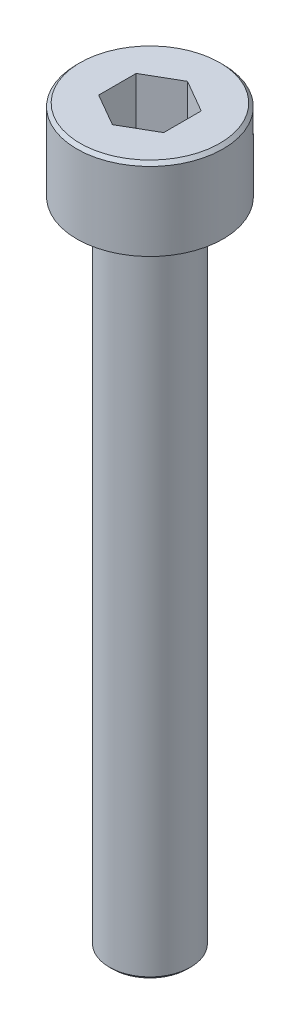
ISO-10303-21;
HEADER;
FILE_DESCRIPTION(('STEP AP214'),'2;1');
FILE_NAME('part.step','',(''),(''),'','','');
FILE_SCHEMA(('AUTOMOTIVE_DESIGN { 1 0 10303 214 1 1 1 1 }'));
ENDSEC;
DATA;
#1=APPLICATION_CONTEXT('core data for automotive mechanical design processes');
#2=APPLICATION_PROTOCOL_DEFINITION('international standard','automotive_design',2000,#1);
#3=PRODUCT_CONTEXT('',#1,'mechanical');
#4=PRODUCT('Part','Part','',(#3));
#5=PRODUCT_RELATED_PRODUCT_CATEGORY('part','',(#4));
#6=PRODUCT_DEFINITION_FORMATION('','',#4);
#7=PRODUCT_DEFINITION_CONTEXT('part definition',#1,'design');
#8=PRODUCT_DEFINITION('design','',#6,#7);
#9=PRODUCT_DEFINITION_SHAPE('','',#8);
#10=(LENGTH_UNIT() NAMED_UNIT(*) SI_UNIT(.MILLI.,.METRE.));
#11=(NAMED_UNIT(*) PLANE_ANGLE_UNIT() SI_UNIT($,.RADIAN.));
#12=(NAMED_UNIT(*) SI_UNIT($,.STERADIAN.) SOLID_ANGLE_UNIT());
#13=UNCERTAINTY_MEASURE_WITH_UNIT(LENGTH_MEASURE(1.E-05),#10,'distance_accuracy_value','');
#14=(GEOMETRIC_REPRESENTATION_CONTEXT(3) GLOBAL_UNCERTAINTY_ASSIGNED_CONTEXT((#13)) GLOBAL_UNIT_ASSIGNED_CONTEXT((#10,
#11,#12)) REPRESENTATION_CONTEXT('',''));
#15=CARTESIAN_POINT('',(0.,0.,0.));
#16=DIRECTION('',(0.,0.,1.));
#17=DIRECTION('',(1.,0.,0.));
#18=AXIS2_PLACEMENT_3D('',#15,#16,#17);
#19=CARTESIAN_POINT('',(1.25000000000001,-20.,0.));
#20=DIRECTION('',(0.,1.,0.));
#21=DIRECTION('',(0.,0.,1.));
#22=AXIS2_PLACEMENT_3D('',#19,#20,#21);
#23=PLANE('',#22);
#24=CARTESIAN_POINT('',(0.,-20.,0.));
#25=DIRECTION('',(0.,1.,0.));
#26=DIRECTION('',(0.,0.,1.));
#27=AXIS2_PLACEMENT_3D('',#24,#25,#26);
#28=CIRCLE('',#27,1.15000000000001);
#29=CARTESIAN_POINT('',(0.,-20.,1.15000000000001));
#30=VERTEX_POINT('',#29);
#31=EDGE_CURVE('E11',#30,#30,#28,.F.);
#32=ORIENTED_EDGE('',*,*,#31,.T.);
#33=EDGE_LOOP('',(#32));
#34=FACE_BOUND('',#33,.T.);
#35=ADVANCED_FACE('F37',(#34),#23,.F.);
#36=CARTESIAN_POINT('',(0.,2.5,0.));
#37=DIRECTION('',(0.,-1.,0.));
#38=DIRECTION('',(0.,0.,-1.));
#39=AXIS2_PLACEMENT_3D('',#36,#37,#38);
#40=PLANE('',#39);
#41=DIRECTION('',(-0.866025403784439,0.,0.5));
#42=VECTOR('',#41,1.);
#43=CARTESIAN_POINT('',(0.,2.5,-1.15470053837925));
#44=LINE('',#43,#42);
#45=CARTESIAN_POINT('',(0.,2.5,-1.15470053837925));
#46=VERTEX_POINT('',#45);
#47=CARTESIAN_POINT('',(-1.,2.5,-0.577350269189626));
#48=VERTEX_POINT('',#47);
#49=EDGE_CURVE('E126',#46,#48,#44,.T.);
#50=ORIENTED_EDGE('',*,*,#49,.F.);
#51=DIRECTION('',(-0.866025403784439,0.,-0.5));
#52=VECTOR('',#51,1.);
#53=CARTESIAN_POINT('',(0.999999999999999,2.5,-0.577350269189626));
#54=LINE('',#53,#52);
#55=CARTESIAN_POINT('',(0.999999999999999,2.5,-0.577350269189626));
#56=VERTEX_POINT('',#55);
#57=EDGE_CURVE('E52',#56,#46,#54,.T.);
#58=ORIENTED_EDGE('',*,*,#57,.F.);
#59=DIRECTION('',(0.,0.,-1.));
#60=VECTOR('',#59,1.);
#61=CARTESIAN_POINT('',(1.,2.5,0.577350269189626));
#62=LINE('',#61,#60);
#63=CARTESIAN_POINT('',(1.,2.5,0.577350269189626));
#64=VERTEX_POINT('',#63);
#65=EDGE_CURVE('E135',#64,#56,#62,.T.);
#66=ORIENTED_EDGE('',*,*,#65,.F.);
#67=DIRECTION('',(0.866025403784439,0.,-0.5));
#68=VECTOR('',#67,1.);
#69=CARTESIAN_POINT('',(0.,2.5,1.15470053837925));
#70=LINE('',#69,#68);
#71=CARTESIAN_POINT('',(0.,2.5,1.15470053837925));
#72=VERTEX_POINT('',#71);
#73=EDGE_CURVE('E133',#72,#64,#70,.T.);
#74=ORIENTED_EDGE('',*,*,#73,.F.);
#75=DIRECTION('',(0.866025403784439,0.,0.5));
#76=VECTOR('',#75,1.);
#77=CARTESIAN_POINT('',(-1.,2.5,0.577350269189626));
#78=LINE('',#77,#76);
#79=CARTESIAN_POINT('',(-1.,2.5,0.577350269189626));
#80=VERTEX_POINT('',#79);
#81=EDGE_CURVE('E100',#80,#72,#78,.T.);
#82=ORIENTED_EDGE('',*,*,#81,.F.);
#83=DIRECTION('',(0.,0.,1.));
#84=VECTOR('',#83,1.);
#85=CARTESIAN_POINT('',(-1.,2.5,-0.577350269189626));
#86=LINE('',#85,#84);
#87=EDGE_CURVE('E129',#48,#80,#86,.T.);
#88=ORIENTED_EDGE('',*,*,#87,.F.);
#89=EDGE_LOOP('',(#50,#58,#66,#74,#82,#88));
#90=FACE_BOUND('',#89,.T.);
#91=CARTESIAN_POINT('',(0.,2.5,0.));
#92=DIRECTION('',(0.,-1.,0.));
#93=DIRECTION('',(0.,0.,-1.));
#94=AXIS2_PLACEMENT_3D('',#91,#92,#93);
#95=CIRCLE('',#94,2.15000000000001);
#96=CARTESIAN_POINT('',(0.,2.5,-2.15000000000001));
#97=VERTEX_POINT('',#96);
#98=EDGE_CURVE('E150',#97,#97,#95,.F.);
#99=ORIENTED_EDGE('',*,*,#98,.T.);
#100=EDGE_LOOP('',(#99));
#101=FACE_BOUND('',#100,.T.);
#102=ADVANCED_FACE('F174',(#90,#101),#40,.F.);
#103=CARTESIAN_POINT('',(0.,28.3884819972091,0.));
#104=DIRECTION('',(0.,1.,0.));
#105=DIRECTION('',(0.,0.,1.));
#106=AXIS2_PLACEMENT_3D('',#103,#104,#105);
#107=CYLINDRICAL_SURFACE('',#106,2.25);
#108=CARTESIAN_POINT('',(0.,2.4,0.));
#109=DIRECTION('',(0.,-1.,0.));
#110=DIRECTION('',(0.,0.,-1.));
#111=AXIS2_PLACEMENT_3D('',#108,#109,#110);
#112=CIRCLE('',#111,2.25);
#113=CARTESIAN_POINT('',(0.,2.4,-2.25));
#114=VERTEX_POINT('',#113);
#115=EDGE_CURVE('E153',#114,#114,#112,.T.);
#116=ORIENTED_EDGE('',*,*,#115,.T.);
#117=EDGE_LOOP('',(#116));
#118=FACE_BOUND('',#117,.T.);
#119=CARTESIAN_POINT('',(0.,0.,0.));
#120=DIRECTION('',(0.,1.,0.));
#121=DIRECTION('',(0.,0.,1.));
#122=AXIS2_PLACEMENT_3D('',#119,#120,#121);
#123=CIRCLE('',#122,2.25);
#124=CARTESIAN_POINT('',(0.,0.,2.25));
#125=VERTEX_POINT('',#124);
#126=EDGE_CURVE('E147',#125,#125,#123,.T.);
#127=ORIENTED_EDGE('',*,*,#126,.T.);
#128=EDGE_LOOP('',(#127));
#129=FACE_BOUND('',#128,.T.);
#130=ADVANCED_FACE('F180',(#118,#129),#107,.T.);
#131=CARTESIAN_POINT('',(2.25,0.,0.));
#132=DIRECTION('',(0.,1.,0.));
#133=DIRECTION('',(0.,0.,1.));
#134=AXIS2_PLACEMENT_3D('',#131,#132,#133);
#135=PLANE('',#134);
#136=ORIENTED_EDGE('',*,*,#126,.F.);
#137=EDGE_LOOP('',(#136));
#138=FACE_BOUND('',#137,.T.);
#139=CARTESIAN_POINT('',(0.,0.,0.));
#140=DIRECTION('',(0.,1.,0.));
#141=DIRECTION('',(0.,0.,1.));
#142=AXIS2_PLACEMENT_3D('',#139,#140,#141);
#143=CIRCLE('',#142,1.25);
#144=CARTESIAN_POINT('',(0.,0.,1.25));
#145=VERTEX_POINT('',#144);
#146=EDGE_CURVE('E139',#145,#145,#143,.T.);
#147=ORIENTED_EDGE('',*,*,#146,.T.);
#148=EDGE_LOOP('',(#147));
#149=FACE_BOUND('',#148,.T.);
#150=ADVANCED_FACE('F186',(#138,#149),#135,.F.);
#151=CARTESIAN_POINT('',(0.,28.3884819972091,0.));
#152=DIRECTION('',(0.,1.,0.));
#153=DIRECTION('',(0.,0.,1.));
#154=AXIS2_PLACEMENT_3D('',#151,#152,#153);
#155=CYLINDRICAL_SURFACE('',#154,1.25);
#156=CARTESIAN_POINT('',(0.,-19.9,0.));
#157=DIRECTION('',(0.,1.,0.));
#158=DIRECTION('',(0.,0.,1.));
#159=AXIS2_PLACEMENT_3D('',#156,#157,#158);
#160=CIRCLE('',#159,1.25);
#161=CARTESIAN_POINT('',(0.,-19.9,1.25));
#162=VERTEX_POINT('',#161);
#163=EDGE_CURVE('E45',#162,#162,#160,.T.);
#164=ORIENTED_EDGE('',*,*,#163,.T.);
#165=EDGE_LOOP('',(#164));
#166=FACE_BOUND('',#165,.T.);
#167=ORIENTED_EDGE('',*,*,#146,.F.);
#168=EDGE_LOOP('',(#167));
#169=FACE_BOUND('',#168,.T.);
#170=ADVANCED_FACE('F158',(#166,#169),#155,.T.);
#171=CARTESIAN_POINT('',(0.,2.5,0.));
#172=DIRECTION('',(0.,-1.,0.));
#173=DIRECTION('',(0.,0.,-1.));
#174=AXIS2_PLACEMENT_3D('',#171,#172,#173);
#175=CONICAL_SURFACE('',#174,2.15000000000001,0.78539816339744);
#176=ORIENTED_EDGE('',*,*,#115,.F.);
#177=EDGE_LOOP('',(#176));
#178=FACE_BOUND('',#177,.T.);
#179=ORIENTED_EDGE('',*,*,#98,.F.);
#180=EDGE_LOOP('',(#179));
#181=FACE_BOUND('',#180,.T.);
#182=ADVANCED_FACE('F163',(#178,#181),#175,.T.);
#183=CARTESIAN_POINT('',(0.,-19.9,0.));
#184=DIRECTION('',(0.,1.,0.));
#185=DIRECTION('',(0.,0.,1.));
#186=AXIS2_PLACEMENT_3D('',#183,#184,#185);
#187=CONICAL_SURFACE('',#186,1.25,0.785398163397405);
#188=ORIENTED_EDGE('',*,*,#31,.F.);
#189=EDGE_LOOP('',(#188));
#190=FACE_BOUND('',#189,.T.);
#191=ORIENTED_EDGE('',*,*,#163,.F.);
#192=EDGE_LOOP('',(#191));
#193=FACE_BOUND('',#192,.T.);
#194=ADVANCED_FACE('F39',(#190,#193),#187,.T.);
#195=CARTESIAN_POINT('',(0.999999999999999,0.5,-0.577350269189626));
#196=DIRECTION('',(0.5,0.,-0.866025403784439));
#197=DIRECTION('',(-0.866025403784439,0.,-0.5));
#198=AXIS2_PLACEMENT_3D('',#195,#196,#197);
#199=PLANE('',#198);
#200=ORIENTED_EDGE('',*,*,#57,.T.);
#201=DIRECTION('',(0.,1.,0.));
#202=VECTOR('',#201,1.);
#203=CARTESIAN_POINT('',(0.,0.5,-1.15470053837925));
#204=LINE('',#203,#202);
#205=CARTESIAN_POINT('',(0.,0.5,-1.15470053837925));
#206=VERTEX_POINT('',#205);
#207=EDGE_CURVE('E82',#206,#46,#204,.T.);
#208=ORIENTED_EDGE('',*,*,#207,.F.);
#209=DIRECTION('',(-0.866025403784439,0.,-0.5));
#210=VECTOR('',#209,1.);
#211=CARTESIAN_POINT('',(0.999999999999999,0.5,-0.577350269189626));
#212=LINE('',#211,#210);
#213=CARTESIAN_POINT('',(0.999999999999999,0.5,-0.577350269189626));
#214=VERTEX_POINT('',#213);
#215=EDGE_CURVE('E137',#214,#206,#212,.T.);
#216=ORIENTED_EDGE('',*,*,#215,.F.);
#217=DIRECTION('',(0.,1.,0.));
#218=VECTOR('',#217,1.);
#219=CARTESIAN_POINT('',(0.999999999999999,0.5,-0.577350269189626));
#220=LINE('',#219,#218);
#221=EDGE_CURVE('E60',#214,#56,#220,.T.);
#222=ORIENTED_EDGE('',*,*,#221,.T.);
#223=EDGE_LOOP('',(#200,#208,#216,#222));
#224=FACE_BOUND('',#223,.T.);
#225=ADVANCED_FACE('F162',(#224),#199,.F.);
#226=CARTESIAN_POINT('',(1.,0.5,0.577350269189626));
#227=DIRECTION('',(1.,0.,0.));
#228=DIRECTION('',(0.,0.,-1.));
#229=AXIS2_PLACEMENT_3D('',#226,#227,#228);
#230=PLANE('',#229);
#231=ORIENTED_EDGE('',*,*,#65,.T.);
#232=ORIENTED_EDGE('',*,*,#221,.F.);
#233=DIRECTION('',(0.,0.,-1.));
#234=VECTOR('',#233,1.);
#235=CARTESIAN_POINT('',(1.,0.5,0.577350269189626));
#236=LINE('',#235,#234);
#237=CARTESIAN_POINT('',(1.,0.5,0.577350269189626));
#238=VERTEX_POINT('',#237);
#239=EDGE_CURVE('E112',#238,#214,#236,.T.);
#240=ORIENTED_EDGE('',*,*,#239,.F.);
#241=DIRECTION('',(0.,1.,0.));
#242=VECTOR('',#241,1.);
#243=CARTESIAN_POINT('',(1.,0.5,0.577350269189626));
#244=LINE('',#243,#242);
#245=EDGE_CURVE('E104',#238,#64,#244,.T.);
#246=ORIENTED_EDGE('',*,*,#245,.T.);
#247=EDGE_LOOP('',(#231,#232,#240,#246));
#248=FACE_BOUND('',#247,.T.);
#249=ADVANCED_FACE('F169',(#248),#230,.F.);
#250=CARTESIAN_POINT('',(0.,0.5,1.15470053837925));
#251=DIRECTION('',(0.5,0.,0.866025403784439));
#252=DIRECTION('',(0.866025403784439,0.,-0.5));
#253=AXIS2_PLACEMENT_3D('',#250,#251,#252);
#254=PLANE('',#253);
#255=ORIENTED_EDGE('',*,*,#73,.T.);
#256=ORIENTED_EDGE('',*,*,#245,.F.);
#257=DIRECTION('',(0.866025403784439,0.,-0.5));
#258=VECTOR('',#257,1.);
#259=CARTESIAN_POINT('',(0.,0.5,1.15470053837925));
#260=LINE('',#259,#258);
#261=CARTESIAN_POINT('',(0.,0.5,1.15470053837925));
#262=VERTEX_POINT('',#261);
#263=EDGE_CURVE('E108',#262,#238,#260,.T.);
#264=ORIENTED_EDGE('',*,*,#263,.F.);
#265=DIRECTION('',(0.,1.,0.));
#266=VECTOR('',#265,1.);
#267=CARTESIAN_POINT('',(0.,0.5,1.15470053837925));
#268=LINE('',#267,#266);
#269=EDGE_CURVE('E93',#262,#72,#268,.T.);
#270=ORIENTED_EDGE('',*,*,#269,.T.);
#271=EDGE_LOOP('',(#255,#256,#264,#270));
#272=FACE_BOUND('',#271,.T.);
#273=ADVANCED_FACE('F109',(#272),#254,.F.);
#274=CARTESIAN_POINT('',(-1.,0.5,0.577350269189626));
#275=DIRECTION('',(-0.5,0.,0.866025403784439));
#276=DIRECTION('',(0.866025403784439,0.,0.5));
#277=AXIS2_PLACEMENT_3D('',#274,#275,#276);
#278=PLANE('',#277);
#279=ORIENTED_EDGE('',*,*,#81,.T.);
#280=ORIENTED_EDGE('',*,*,#269,.F.);
#281=DIRECTION('',(0.866025403784439,0.,0.5));
#282=VECTOR('',#281,1.);
#283=CARTESIAN_POINT('',(-1.,0.5,0.577350269189626));
#284=LINE('',#283,#282);
#285=CARTESIAN_POINT('',(-1.,0.5,0.577350269189626));
#286=VERTEX_POINT('',#285);
#287=EDGE_CURVE('E97',#286,#262,#284,.T.);
#288=ORIENTED_EDGE('',*,*,#287,.F.);
#289=DIRECTION('',(0.,1.,0.));
#290=VECTOR('',#289,1.);
#291=CARTESIAN_POINT('',(-1.,0.5,0.577350269189626));
#292=LINE('',#291,#290);
#293=EDGE_CURVE('E105',#286,#80,#292,.T.);
#294=ORIENTED_EDGE('',*,*,#293,.T.);
#295=EDGE_LOOP('',(#279,#280,#288,#294));
#296=FACE_BOUND('',#295,.T.);
#297=ADVANCED_FACE('F95',(#296),#278,.F.);
#298=CARTESIAN_POINT('',(-1.,0.5,-0.577350269189626));
#299=DIRECTION('',(-1.,0.,0.));
#300=DIRECTION('',(0.,0.,1.));
#301=AXIS2_PLACEMENT_3D('',#298,#299,#300);
#302=PLANE('',#301);
#303=ORIENTED_EDGE('',*,*,#87,.T.);
#304=ORIENTED_EDGE('',*,*,#293,.F.);
#305=DIRECTION('',(0.,0.,1.));
#306=VECTOR('',#305,1.);
#307=CARTESIAN_POINT('',(-1.,0.5,-0.577350269189626));
#308=LINE('',#307,#306);
#309=CARTESIAN_POINT('',(-1.,0.5,-0.577350269189626));
#310=VERTEX_POINT('',#309);
#311=EDGE_CURVE('E118',#310,#286,#308,.T.);
#312=ORIENTED_EDGE('',*,*,#311,.F.);
#313=DIRECTION('',(0.,1.,0.));
#314=VECTOR('',#313,1.);
#315=CARTESIAN_POINT('',(-1.,0.5,-0.577350269189626));
#316=LINE('',#315,#314);
#317=EDGE_CURVE('E142',#310,#48,#316,.T.);
#318=ORIENTED_EDGE('',*,*,#317,.T.);
#319=EDGE_LOOP('',(#303,#304,#312,#318));
#320=FACE_BOUND('',#319,.T.);
#321=ADVANCED_FACE('F196',(#320),#302,.F.);
#322=CARTESIAN_POINT('',(0.,0.5,-1.15470053837925));
#323=DIRECTION('',(-0.5,0.,-0.866025403784439));
#324=DIRECTION('',(-0.866025403784439,0.,0.5));
#325=AXIS2_PLACEMENT_3D('',#322,#323,#324);
#326=PLANE('',#325);
#327=ORIENTED_EDGE('',*,*,#49,.T.);
#328=ORIENTED_EDGE('',*,*,#317,.F.);
#329=DIRECTION('',(-0.866025403784439,0.,0.5));
#330=VECTOR('',#329,1.);
#331=CARTESIAN_POINT('',(0.,0.5,-1.15470053837925));
#332=LINE('',#331,#330);
#333=EDGE_CURVE('E120',#206,#310,#332,.T.);
#334=ORIENTED_EDGE('',*,*,#333,.F.);
#335=ORIENTED_EDGE('',*,*,#207,.T.);
#336=EDGE_LOOP('',(#327,#328,#334,#335));
#337=FACE_BOUND('',#336,.T.);
#338=ADVANCED_FACE('F193',(#337),#326,.F.);
#339=CARTESIAN_POINT('',(0.,0.5,-1.15470053837925));
#340=DIRECTION('',(0.,1.,0.));
#341=DIRECTION('',(0.,0.,1.));
#342=AXIS2_PLACEMENT_3D('',#339,#340,#341);
#343=PLANE('',#342);
#344=ORIENTED_EDGE('',*,*,#215,.T.);
#345=ORIENTED_EDGE('',*,*,#333,.T.);
#346=ORIENTED_EDGE('',*,*,#311,.T.);
#347=ORIENTED_EDGE('',*,*,#287,.T.);
#348=ORIENTED_EDGE('',*,*,#263,.T.);
#349=ORIENTED_EDGE('',*,*,#239,.T.);
#350=EDGE_LOOP('',(#344,#345,#346,#347,#348,#349));
#351=FACE_BOUND('',#350,.T.);
#352=ADVANCED_FACE('F115',(#351),#343,.T.);
#353=CLOSED_SHELL('',(#35,#102,#130,#150,#170,#182,#194,#225,#249,#273,#297,#321,#338,#352));
#354=MANIFOLD_SOLID_BREP('B2',#353);
#355=ADVANCED_BREP_SHAPE_REPRESENTATION('',(#18,#354),#14);
#356=SHAPE_DEFINITION_REPRESENTATION(#9,#355);
ENDSEC;
END-ISO-10303-21;
